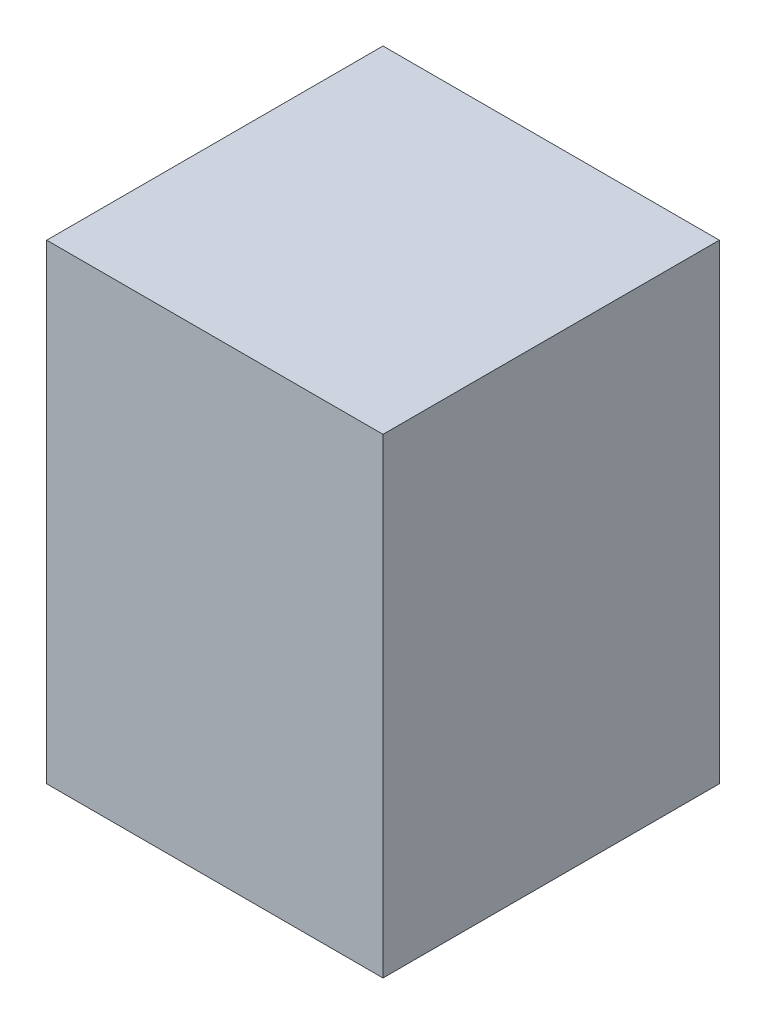
ISO-10303-21;
HEADER;
FILE_DESCRIPTION(('STEP AP214'),'2;1');
FILE_NAME('part.step','',(''),(''),'','','');
FILE_SCHEMA(('AUTOMOTIVE_DESIGN { 1 0 10303 214 1 1 1 1 }'));
ENDSEC;
DATA;
#1=APPLICATION_CONTEXT('core data for automotive mechanical design processes');
#2=APPLICATION_PROTOCOL_DEFINITION('international standard','automotive_design',2000,#1);
#3=PRODUCT_CONTEXT('',#1,'mechanical');
#4=PRODUCT('Part','Part','',(#3));
#5=PRODUCT_RELATED_PRODUCT_CATEGORY('part','',(#4));
#6=PRODUCT_DEFINITION_FORMATION('','',#4);
#7=PRODUCT_DEFINITION_CONTEXT('part definition',#1,'design');
#8=PRODUCT_DEFINITION('design','',#6,#7);
#9=PRODUCT_DEFINITION_SHAPE('','',#8);
#10=(LENGTH_UNIT() NAMED_UNIT(*) SI_UNIT(.MILLI.,.METRE.));
#11=(NAMED_UNIT(*) PLANE_ANGLE_UNIT() SI_UNIT($,.RADIAN.));
#12=(NAMED_UNIT(*) SI_UNIT($,.STERADIAN.) SOLID_ANGLE_UNIT());
#13=UNCERTAINTY_MEASURE_WITH_UNIT(LENGTH_MEASURE(1.E-05),#10,'distance_accuracy_value','');
#14=(GEOMETRIC_REPRESENTATION_CONTEXT(3) GLOBAL_UNCERTAINTY_ASSIGNED_CONTEXT((#13)) GLOBAL_UNIT_ASSIGNED_CONTEXT((#10,
#11,#12)) REPRESENTATION_CONTEXT('',''));
#15=CARTESIAN_POINT('',(0.,0.,0.));
#16=DIRECTION('',(0.,0.,1.));
#17=DIRECTION('',(1.,0.,0.));
#18=AXIS2_PLACEMENT_3D('',#15,#16,#17);
#19=CARTESIAN_POINT('',(25.,-70.,-23.6742424242424));
#20=DIRECTION('',(1.,0.,0.));
#21=DIRECTION('',(0.,0.,-1.));
#22=AXIS2_PLACEMENT_3D('',#19,#20,#21);
#23=PLANE('',#22);
#24=DIRECTION('',(0.,0.,-1.));
#25=VECTOR('',#24,1.);
#26=CARTESIAN_POINT('',(25.,0.,-23.6742424242424));
#27=LINE('',#26,#25);
#28=CARTESIAN_POINT('',(25.,0.,26.3257575757576));
#29=VERTEX_POINT('',#28);
#30=CARTESIAN_POINT('',(25.,0.,-23.6742424242424));
#31=VERTEX_POINT('',#30);
#32=EDGE_CURVE('E96',#29,#31,#27,.T.);
#33=ORIENTED_EDGE('',*,*,#32,.F.);
#34=DIRECTION('',(0.,1.,0.));
#35=VECTOR('',#34,1.);
#36=CARTESIAN_POINT('',(25.,-70.,26.3257575757576));
#37=LINE('',#36,#35);
#38=CARTESIAN_POINT('',(25.,-70.,26.3257575757576));
#39=VERTEX_POINT('',#38);
#40=EDGE_CURVE('E11',#39,#29,#37,.T.);
#41=ORIENTED_EDGE('',*,*,#40,.F.);
#42=DIRECTION('',(0.,0.,-1.));
#43=VECTOR('',#42,1.);
#44=CARTESIAN_POINT('',(25.,-70.,-23.6742424242424));
#45=LINE('',#44,#43);
#46=CARTESIAN_POINT('',(25.,-70.,-23.6742424242424));
#47=VERTEX_POINT('',#46);
#48=EDGE_CURVE('E90',#39,#47,#45,.T.);
#49=ORIENTED_EDGE('',*,*,#48,.T.);
#50=DIRECTION('',(0.,1.,0.));
#51=VECTOR('',#50,1.);
#52=CARTESIAN_POINT('',(25.,-70.,-23.6742424242424));
#53=LINE('',#52,#51);
#54=EDGE_CURVE('E35',#47,#31,#53,.T.);
#55=ORIENTED_EDGE('',*,*,#54,.T.);
#56=EDGE_LOOP('',(#33,#41,#49,#55));
#57=FACE_BOUND('',#56,.T.);
#58=ADVANCED_FACE('F32',(#57),#23,.T.);
#59=CARTESIAN_POINT('',(-25.,-70.,26.3257575757576));
#60=DIRECTION('',(0.,0.,1.));
#61=DIRECTION('',(1.,0.,0.));
#62=AXIS2_PLACEMENT_3D('',#59,#60,#61);
#63=PLANE('',#62);
#64=DIRECTION('',(1.,0.,0.));
#65=VECTOR('',#64,1.);
#66=CARTESIAN_POINT('',(-25.,0.,26.3257575757576));
#67=LINE('',#66,#65);
#68=CARTESIAN_POINT('',(-25.,0.,26.3257575757576));
#69=VERTEX_POINT('',#68);
#70=EDGE_CURVE('E92',#69,#29,#67,.T.);
#71=ORIENTED_EDGE('',*,*,#70,.F.);
#72=DIRECTION('',(0.,1.,0.));
#73=VECTOR('',#72,1.);
#74=CARTESIAN_POINT('',(-25.,-70.,26.3257575757576));
#75=LINE('',#74,#73);
#76=CARTESIAN_POINT('',(-25.,-70.,26.3257575757576));
#77=VERTEX_POINT('',#76);
#78=EDGE_CURVE('E41',#77,#69,#75,.T.);
#79=ORIENTED_EDGE('',*,*,#78,.F.);
#80=DIRECTION('',(1.,0.,0.));
#81=VECTOR('',#80,1.);
#82=CARTESIAN_POINT('',(-25.,-70.,26.3257575757576));
#83=LINE('',#82,#81);
#84=EDGE_CURVE('E87',#77,#39,#83,.T.);
#85=ORIENTED_EDGE('',*,*,#84,.T.);
#86=ORIENTED_EDGE('',*,*,#40,.T.);
#87=EDGE_LOOP('',(#71,#79,#85,#86));
#88=FACE_BOUND('',#87,.T.);
#89=ADVANCED_FACE('F106',(#88),#63,.T.);
#90=CARTESIAN_POINT('',(-25.,-70.,-23.6742424242424));
#91=DIRECTION('',(-1.,0.,0.));
#92=DIRECTION('',(0.,0.,1.));
#93=AXIS2_PLACEMENT_3D('',#90,#91,#92);
#94=PLANE('',#93);
#95=DIRECTION('',(0.,0.,1.));
#96=VECTOR('',#95,1.);
#97=CARTESIAN_POINT('',(-25.,0.,-23.6742424242424));
#98=LINE('',#97,#96);
#99=CARTESIAN_POINT('',(-25.,0.,-23.6742424242424));
#100=VERTEX_POINT('',#99);
#101=EDGE_CURVE('E82',#100,#69,#98,.T.);
#102=ORIENTED_EDGE('',*,*,#101,.F.);
#103=DIRECTION('',(0.,1.,0.));
#104=VECTOR('',#103,1.);
#105=CARTESIAN_POINT('',(-25.,-70.,-23.6742424242424));
#106=LINE('',#105,#104);
#107=CARTESIAN_POINT('',(-25.,-70.,-23.6742424242424));
#108=VERTEX_POINT('',#107);
#109=EDGE_CURVE('E77',#108,#100,#106,.T.);
#110=ORIENTED_EDGE('',*,*,#109,.F.);
#111=DIRECTION('',(0.,0.,1.));
#112=VECTOR('',#111,1.);
#113=CARTESIAN_POINT('',(-25.,-70.,-23.6742424242424));
#114=LINE('',#113,#112);
#115=EDGE_CURVE('E80',#108,#77,#114,.T.);
#116=ORIENTED_EDGE('',*,*,#115,.T.);
#117=ORIENTED_EDGE('',*,*,#78,.T.);
#118=EDGE_LOOP('',(#102,#110,#116,#117));
#119=FACE_BOUND('',#118,.T.);
#120=ADVANCED_FACE('F79',(#119),#94,.T.);
#121=CARTESIAN_POINT('',(-25.,-70.,-23.6742424242424));
#122=DIRECTION('',(0.,0.,-1.));
#123=DIRECTION('',(-1.,0.,0.));
#124=AXIS2_PLACEMENT_3D('',#121,#122,#123);
#125=PLANE('',#124);
#126=DIRECTION('',(-1.,0.,0.));
#127=VECTOR('',#126,1.);
#128=CARTESIAN_POINT('',(-25.,0.,-23.6742424242424));
#129=LINE('',#128,#127);
#130=EDGE_CURVE('E99',#31,#100,#129,.T.);
#131=ORIENTED_EDGE('',*,*,#130,.F.);
#132=ORIENTED_EDGE('',*,*,#54,.F.);
#133=DIRECTION('',(-1.,0.,0.));
#134=VECTOR('',#133,1.);
#135=CARTESIAN_POINT('',(-25.,-70.,-23.6742424242424));
#136=LINE('',#135,#134);
#137=EDGE_CURVE('E86',#47,#108,#136,.T.);
#138=ORIENTED_EDGE('',*,*,#137,.T.);
#139=ORIENTED_EDGE('',*,*,#109,.T.);
#140=EDGE_LOOP('',(#131,#132,#138,#139));
#141=FACE_BOUND('',#140,.T.);
#142=ADVANCED_FACE('F89',(#141),#125,.T.);
#143=CARTESIAN_POINT('',(0.,-70.,0.));
#144=DIRECTION('',(0.,1.,0.));
#145=DIRECTION('',(0.,0.,1.));
#146=AXIS2_PLACEMENT_3D('',#143,#144,#145);
#147=PLANE('',#146);
#148=ORIENTED_EDGE('',*,*,#48,.F.);
#149=ORIENTED_EDGE('',*,*,#84,.F.);
#150=ORIENTED_EDGE('',*,*,#115,.F.);
#151=ORIENTED_EDGE('',*,*,#137,.F.);
#152=EDGE_LOOP('',(#148,#149,#150,#151));
#153=FACE_BOUND('',#152,.T.);
#154=ADVANCED_FACE('F85',(#153),#147,.F.);
#155=CARTESIAN_POINT('',(0.,0.,0.));
#156=DIRECTION('',(0.,1.,0.));
#157=DIRECTION('',(0.,0.,1.));
#158=AXIS2_PLACEMENT_3D('',#155,#156,#157);
#159=PLANE('',#158);
#160=ORIENTED_EDGE('',*,*,#32,.T.);
#161=ORIENTED_EDGE('',*,*,#130,.T.);
#162=ORIENTED_EDGE('',*,*,#101,.T.);
#163=ORIENTED_EDGE('',*,*,#70,.T.);
#164=EDGE_LOOP('',(#160,#161,#162,#163));
#165=FACE_BOUND('',#164,.T.);
#166=ADVANCED_FACE('F105',(#165),#159,.T.);
#167=CLOSED_SHELL('',(#58,#89,#120,#142,#154,#166));
#168=MANIFOLD_SOLID_BREP('B2',#167);
#169=ADVANCED_BREP_SHAPE_REPRESENTATION('',(#18,#168),#14);
#170=SHAPE_DEFINITION_REPRESENTATION(#9,#169);
ENDSEC;
END-ISO-10303-21;
